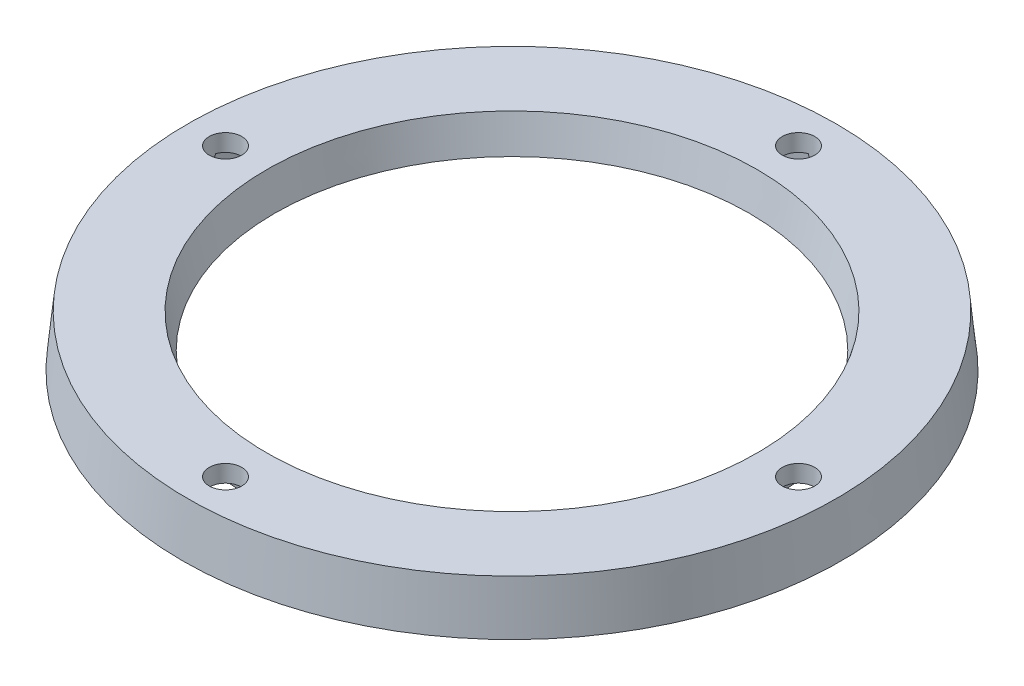
ISO-10303-21;
HEADER;
FILE_DESCRIPTION(('STEP AP214'),'2;1');
FILE_NAME('part.step','',(''),(''),'','','');
FILE_SCHEMA(('AUTOMOTIVE_DESIGN { 1 0 10303 214 1 1 1 1 }'));
ENDSEC;
DATA;
#1=APPLICATION_CONTEXT('core data for automotive mechanical design processes');
#2=APPLICATION_PROTOCOL_DEFINITION('international standard','automotive_design',2000,#1);
#3=PRODUCT_CONTEXT('',#1,'mechanical');
#4=PRODUCT('Part','Part','',(#3));
#5=PRODUCT_RELATED_PRODUCT_CATEGORY('part','',(#4));
#6=PRODUCT_DEFINITION_FORMATION('','',#4);
#7=PRODUCT_DEFINITION_CONTEXT('part definition',#1,'design');
#8=PRODUCT_DEFINITION('design','',#6,#7);
#9=PRODUCT_DEFINITION_SHAPE('','',#8);
#10=(LENGTH_UNIT() NAMED_UNIT(*) SI_UNIT(.MILLI.,.METRE.));
#11=(NAMED_UNIT(*) PLANE_ANGLE_UNIT() SI_UNIT($,.RADIAN.));
#12=(NAMED_UNIT(*) SI_UNIT($,.STERADIAN.) SOLID_ANGLE_UNIT());
#13=UNCERTAINTY_MEASURE_WITH_UNIT(LENGTH_MEASURE(1.E-05),#10,'distance_accuracy_value','');
#14=(GEOMETRIC_REPRESENTATION_CONTEXT(3) GLOBAL_UNCERTAINTY_ASSIGNED_CONTEXT((#13)) GLOBAL_UNIT_ASSIGNED_CONTEXT((#10,
#11,#12)) REPRESENTATION_CONTEXT('',''));
#15=CARTESIAN_POINT('',(0.,0.,0.));
#16=DIRECTION('',(0.,0.,1.));
#17=DIRECTION('',(1.,0.,0.));
#18=AXIS2_PLACEMENT_3D('',#15,#16,#17);
#19=CARTESIAN_POINT('',(0.,0.,25.085));
#20=DIRECTION('',(0.,1.,0.));
#21=DIRECTION('',(0.,0.,1.));
#22=AXIS2_PLACEMENT_3D('',#19,#20,#21);
#23=PLANE('',#22);
#24=CARTESIAN_POINT('',(0.,0.,0.));
#25=DIRECTION('',(0.,-1.,0.));
#26=DIRECTION('',(0.,0.,-1.));
#27=AXIS2_PLACEMENT_3D('',#24,#25,#26);
#28=CIRCLE('',#27,25.085);
#29=CARTESIAN_POINT('',(0.,0.,-25.085));
#30=VERTEX_POINT('',#29);
#31=EDGE_CURVE('E116',#30,#30,#28,.T.);
#32=ORIENTED_EDGE('',*,*,#31,.F.);
#33=EDGE_LOOP('',(#32));
#34=FACE_BOUND('',#33,.T.);
#35=CARTESIAN_POINT('',(0.,0.,0.));
#36=DIRECTION('',(0.,-1.,0.));
#37=DIRECTION('',(0.,0.,-1.));
#38=AXIS2_PLACEMENT_3D('',#35,#36,#37);
#39=CIRCLE('',#38,27.085);
#40=CARTESIAN_POINT('',(0.,0.,-27.085));
#41=VERTEX_POINT('',#40);
#42=EDGE_CURVE('E95',#41,#41,#39,.T.);
#43=ORIENTED_EDGE('',*,*,#42,.T.);
#44=EDGE_LOOP('',(#43));
#45=FACE_BOUND('',#44,.T.);
#46=ADVANCED_FACE('F39',(#34,#45),#23,.F.);
#47=CARTESIAN_POINT('',(0.,4.22,0.));
#48=DIRECTION('',(0.,-1.,0.));
#49=DIRECTION('',(0.,0.,-1.));
#50=AXIS2_PLACEMENT_3D('',#47,#48,#49);
#51=CONICAL_SURFACE('',#50,26.665,0.0991993892689203);
#52=ORIENTED_EDGE('',*,*,#42,.F.);
#53=EDGE_LOOP('',(#52));
#54=FACE_BOUND('',#53,.T.);
#55=CARTESIAN_POINT('',(0.,4.22,0.));
#56=DIRECTION('',(0.,-1.,0.));
#57=DIRECTION('',(0.,0.,-1.));
#58=AXIS2_PLACEMENT_3D('',#55,#56,#57);
#59=CIRCLE('',#58,26.665);
#60=CARTESIAN_POINT('',(0.,4.22,-26.665));
#61=VERTEX_POINT('',#60);
#62=EDGE_CURVE('E138',#61,#61,#59,.T.);
#63=ORIENTED_EDGE('',*,*,#62,.T.);
#64=EDGE_LOOP('',(#63));
#65=FACE_BOUND('',#64,.T.);
#66=ADVANCED_FACE('F202',(#54,#65),#51,.T.);
#67=CARTESIAN_POINT('',(0.,4.22,26.665));
#68=DIRECTION('',(0.,-1.,0.));
#69=DIRECTION('',(0.,0.,-1.));
#70=AXIS2_PLACEMENT_3D('',#67,#68,#69);
#71=PLANE('',#70);
#72=CARTESIAN_POINT('',(-23.546655813512,4.22,0.));
#73=DIRECTION('',(0.,-1.,0.));
#74=DIRECTION('',(0.,0.,-1.));
#75=AXIS2_PLACEMENT_3D('',#72,#73,#74);
#76=CIRCLE('',#75,1.335);
#77=CARTESIAN_POINT('',(-23.546655813512,4.22,-1.335));
#78=VERTEX_POINT('',#77);
#79=EDGE_CURVE('E191',#78,#78,#76,.T.);
#80=ORIENTED_EDGE('',*,*,#79,.T.);
#81=EDGE_LOOP('',(#80));
#82=FACE_BOUND('',#81,.T.);
#83=CARTESIAN_POINT('',(0.,4.22,-23.546655813512));
#84=DIRECTION('',(0.,-1.,0.));
#85=DIRECTION('',(0.,0.,-1.));
#86=AXIS2_PLACEMENT_3D('',#83,#84,#85);
#87=CIRCLE('',#86,1.335);
#88=CARTESIAN_POINT('',(0.,4.22,-24.881655813512));
#89=VERTEX_POINT('',#88);
#90=EDGE_CURVE('E179',#89,#89,#87,.T.);
#91=ORIENTED_EDGE('',*,*,#90,.T.);
#92=EDGE_LOOP('',(#91));
#93=FACE_BOUND('',#92,.T.);
#94=CARTESIAN_POINT('',(23.546655813512,4.22,0.));
#95=DIRECTION('',(0.,-1.,0.));
#96=DIRECTION('',(0.,0.,-1.));
#97=AXIS2_PLACEMENT_3D('',#94,#95,#96);
#98=CIRCLE('',#97,1.335);
#99=CARTESIAN_POINT('',(23.546655813512,4.22,-1.335));
#100=VERTEX_POINT('',#99);
#101=EDGE_CURVE('E180',#100,#100,#98,.T.);
#102=ORIENTED_EDGE('',*,*,#101,.T.);
#103=EDGE_LOOP('',(#102));
#104=FACE_BOUND('',#103,.T.);
#105=CARTESIAN_POINT('',(0.,4.22,23.546655813512));
#106=DIRECTION('',(0.,-1.,0.));
#107=DIRECTION('',(0.,0.,-1.));
#108=AXIS2_PLACEMENT_3D('',#105,#106,#107);
#109=CIRCLE('',#108,1.335);
#110=CARTESIAN_POINT('',(0.,4.22,22.211655813512));
#111=VERTEX_POINT('',#110);
#112=EDGE_CURVE('E104',#111,#111,#109,.T.);
#113=ORIENTED_EDGE('',*,*,#112,.T.);
#114=EDGE_LOOP('',(#113));
#115=FACE_BOUND('',#114,.T.);
#116=ORIENTED_EDGE('',*,*,#62,.F.);
#117=EDGE_LOOP('',(#116));
#118=FACE_BOUND('',#117,.T.);
#119=CARTESIAN_POINT('',(0.,4.22,0.));
#120=DIRECTION('',(0.,-1.,0.));
#121=DIRECTION('',(0.,0.,-1.));
#122=AXIS2_PLACEMENT_3D('',#119,#120,#121);
#123=CIRCLE('',#122,20.165);
#124=CARTESIAN_POINT('',(0.,4.22,-20.165));
#125=VERTEX_POINT('',#124);
#126=EDGE_CURVE('E134',#125,#125,#123,.T.);
#127=ORIENTED_EDGE('',*,*,#126,.T.);
#128=EDGE_LOOP('',(#127));
#129=FACE_BOUND('',#128,.T.);
#130=ADVANCED_FACE('F207',(#82,#93,#104,#115,#118,#129),#71,.F.);
#131=CARTESIAN_POINT('',(0.,1.43,0.));
#132=DIRECTION('',(0.,1.,0.));
#133=DIRECTION('',(0.,0.,1.));
#134=AXIS2_PLACEMENT_3D('',#131,#132,#133);
#135=CONICAL_SURFACE('',#134,19.515,0.228891989947314);
#136=ORIENTED_EDGE('',*,*,#126,.F.);
#137=EDGE_LOOP('',(#136));
#138=FACE_BOUND('',#137,.T.);
#139=CARTESIAN_POINT('',(0.,1.43,0.));
#140=DIRECTION('',(0.,-1.,0.));
#141=DIRECTION('',(0.,0.,-1.));
#142=AXIS2_PLACEMENT_3D('',#139,#140,#141);
#143=CIRCLE('',#142,19.515);
#144=CARTESIAN_POINT('',(0.,1.43,-19.515));
#145=VERTEX_POINT('',#144);
#146=EDGE_CURVE('E130',#145,#145,#143,.T.);
#147=ORIENTED_EDGE('',*,*,#146,.T.);
#148=EDGE_LOOP('',(#147));
#149=FACE_BOUND('',#148,.T.);
#150=ADVANCED_FACE('F212',(#138,#149),#135,.F.);
#151=CARTESIAN_POINT('',(0.,1.43,19.515));
#152=DIRECTION('',(0.,1.,0.));
#153=DIRECTION('',(0.,0.,1.));
#154=AXIS2_PLACEMENT_3D('',#151,#152,#153);
#155=PLANE('',#154);
#156=ORIENTED_EDGE('',*,*,#146,.F.);
#157=EDGE_LOOP('',(#156));
#158=FACE_BOUND('',#157,.T.);
#159=CARTESIAN_POINT('',(0.,1.43,0.));
#160=DIRECTION('',(0.,-1.,0.));
#161=DIRECTION('',(0.,0.,-1.));
#162=AXIS2_PLACEMENT_3D('',#159,#160,#161);
#163=CIRCLE('',#162,21.195);
#164=CARTESIAN_POINT('',(0.,1.43,-21.195));
#165=VERTEX_POINT('',#164);
#166=EDGE_CURVE('E126',#165,#165,#163,.T.);
#167=ORIENTED_EDGE('',*,*,#166,.T.);
#168=EDGE_LOOP('',(#167));
#169=FACE_BOUND('',#168,.T.);
#170=ADVANCED_FACE('F218',(#158,#169),#155,.F.);
#171=CARTESIAN_POINT('',(0.,2.81,0.));
#172=DIRECTION('',(0.,1.,0.));
#173=DIRECTION('',(0.,0.,1.));
#174=AXIS2_PLACEMENT_3D('',#171,#172,#173);
#175=CONICAL_SURFACE('',#174,21.5165053763441,0.228891989947315);
#176=ORIENTED_EDGE('',*,*,#166,.F.);
#177=EDGE_LOOP('',(#176));
#178=FACE_BOUND('',#177,.T.);
#179=CARTESIAN_POINT('',(0.,2.81,0.));
#180=DIRECTION('',(0.,-1.,0.));
#181=DIRECTION('',(0.,0.,-1.));
#182=AXIS2_PLACEMENT_3D('',#179,#180,#181);
#183=CIRCLE('',#182,21.5165053763441);
#184=CARTESIAN_POINT('',(0.,2.81,-21.5165053763441));
#185=VERTEX_POINT('',#184);
#186=EDGE_CURVE('E121',#185,#185,#183,.T.);
#187=ORIENTED_EDGE('',*,*,#186,.T.);
#188=EDGE_LOOP('',(#187));
#189=FACE_BOUND('',#188,.T.);
#190=ADVANCED_FACE('F224',(#178,#189),#175,.T.);
#191=CARTESIAN_POINT('',(0.,2.81,21.5165053763441));
#192=DIRECTION('',(0.,1.,0.));
#193=DIRECTION('',(0.,0.,1.));
#194=AXIS2_PLACEMENT_3D('',#191,#192,#193);
#195=PLANE('',#194);
#196=ORIENTED_EDGE('',*,*,#186,.F.);
#197=EDGE_LOOP('',(#196));
#198=FACE_BOUND('',#197,.T.);
#199=CARTESIAN_POINT('',(0.,2.81,0.));
#200=DIRECTION('',(0.,-1.,0.));
#201=DIRECTION('',(0.,0.,-1.));
#202=AXIS2_PLACEMENT_3D('',#199,#200,#201);
#203=CIRCLE('',#202,24.8053317535545);
#204=CARTESIAN_POINT('',(-0.456644352418415,2.81,24.8011281868246));
#205=VERTEX_POINT('',#204);
#206=CARTESIAN_POINT('',(-24.8011281868246,2.81,0.456644352418356));
#207=VERTEX_POINT('',#206);
#208=EDGE_CURVE('E100',#205,#207,#203,.T.);
#209=ORIENTED_EDGE('',*,*,#208,.T.);
#210=CARTESIAN_POINT('',(-23.546655813512,2.81,0.));
#211=DIRECTION('',(0.,1.,0.));
#212=DIRECTION('',(0.,0.,1.));
#213=AXIS2_PLACEMENT_3D('',#210,#211,#212);
#214=CIRCLE('',#213,1.335);
#215=CARTESIAN_POINT('',(-24.8011281868246,2.81,-0.456644352418414));
#216=VERTEX_POINT('',#215);
#217=EDGE_CURVE('E66',#207,#216,#214,.T.);
#218=ORIENTED_EDGE('',*,*,#217,.T.);
#219=CARTESIAN_POINT('',(-0.456644352418349,2.81,-24.8011281868246));
#220=VERTEX_POINT('',#219);
#221=EDGE_CURVE('E110',#216,#220,#203,.T.);
#222=ORIENTED_EDGE('',*,*,#221,.T.);
#223=CARTESIAN_POINT('',(0.,2.81,-23.546655813512));
#224=DIRECTION('',(0.,1.,0.));
#225=DIRECTION('',(0.,0.,1.));
#226=AXIS2_PLACEMENT_3D('',#223,#224,#225);
#227=CIRCLE('',#226,1.335);
#228=CARTESIAN_POINT('',(0.456644352418415,2.81,-24.8011281868246));
#229=VERTEX_POINT('',#228);
#230=EDGE_CURVE('E59',#220,#229,#227,.T.);
#231=ORIENTED_EDGE('',*,*,#230,.T.);
#232=CARTESIAN_POINT('',(24.8011281868246,2.81,-0.456644352418347));
#233=VERTEX_POINT('',#232);
#234=EDGE_CURVE('E114',#229,#233,#203,.T.);
#235=ORIENTED_EDGE('',*,*,#234,.T.);
#236=CARTESIAN_POINT('',(23.546655813512,2.81,0.));
#237=DIRECTION('',(0.,1.,0.));
#238=DIRECTION('',(0.,0.,1.));
#239=AXIS2_PLACEMENT_3D('',#236,#237,#238);
#240=CIRCLE('',#239,1.335);
#241=CARTESIAN_POINT('',(24.8011281868246,2.81,0.456644352418414));
#242=VERTEX_POINT('',#241);
#243=EDGE_CURVE('E177',#233,#242,#240,.T.);
#244=ORIENTED_EDGE('',*,*,#243,.T.);
#245=CARTESIAN_POINT('',(0.456644352418348,2.81,24.8011281868246));
#246=VERTEX_POINT('',#245);
#247=EDGE_CURVE('E102',#242,#246,#203,.T.);
#248=ORIENTED_EDGE('',*,*,#247,.T.);
#249=CARTESIAN_POINT('',(0.,2.81,23.546655813512));
#250=DIRECTION('',(0.,1.,0.));
#251=DIRECTION('',(0.,0.,1.));
#252=AXIS2_PLACEMENT_3D('',#249,#250,#251);
#253=CIRCLE('',#252,1.335);
#254=EDGE_CURVE('E88',#246,#205,#253,.T.);
#255=ORIENTED_EDGE('',*,*,#254,.T.);
#256=EDGE_LOOP('',(#209,#218,#222,#231,#235,#244,#248,#255));
#257=FACE_BOUND('',#256,.T.);
#258=ADVANCED_FACE('F99',(#198,#257),#195,.F.);
#259=CARTESIAN_POINT('',(0.,0.,0.));
#260=DIRECTION('',(0.,-1.,0.));
#261=DIRECTION('',(0.,0.,-1.));
#262=AXIS2_PLACEMENT_3D('',#259,#260,#261);
#263=CONICAL_SURFACE('',#262,25.085,0.0991993892689197);
#264=ORIENTED_EDGE('',*,*,#221,.F.);
#265=CARTESIAN_POINT('',(-24.8011072175954,2.81020000000008,-0.456701954006309));
#266=CARTESIAN_POINT('',(-24.8063640892538,2.76006097805554,-0.442211795328551));
#267=CARTESIAN_POINT('',(-24.811604977043,2.71008972835411,-0.42708790749464));
#268=CARTESIAN_POINT('',(-24.8220965376518,2.61008356769663,-0.394690385683538));
#269=CARTESIAN_POINT('',(-24.8273463444478,2.56005732383127,-0.37738992713461));
#270=CARTESIAN_POINT('',(-24.8383836286508,2.45491252334263,-0.337852218514495));
#271=CARTESIAN_POINT('',(-24.8441587768961,2.39991525507899,-0.315270386923622));
#272=CARTESIAN_POINT('',(-24.8526038479423,2.31951758866946,-0.277285599035937));
#273=CARTESIAN_POINT('',(-24.8553747709132,2.29314252106301,-0.263983717677163));
#274=CARTESIAN_POINT('',(-24.8608066732607,2.24144681497118,-0.235469897016068));
#275=CARTESIAN_POINT('',(-24.8634678083418,2.21612468274836,-0.22026079568063));
#276=CARTESIAN_POINT('',(-24.8679178812149,2.17378587962839,-0.191425430640762));
#277=CARTESIAN_POINT('',(-24.8697516458518,2.15634106441682,-0.178440860770825));
#278=CARTESIAN_POINT('',(-24.8732241658947,2.12330977449401,-0.150465948412871));
#279=CARTESIAN_POINT('',(-24.8748646994933,2.10770635144756,-0.135497126525794));
#280=CARTESIAN_POINT('',(-24.8770415631904,2.0870033891626,-0.11117951759538));
#281=CARTESIAN_POINT('',(-24.877710220859,2.08064443177077,-0.102926990568714));
#282=CARTESIAN_POINT('',(-24.8789328396104,2.06901765882317,-0.0856616578352358));
#283=CARTESIAN_POINT('',(-24.8794868406719,2.06374946293712,-0.0766491186797244));
#284=CARTESIAN_POINT('',(-24.8803615933126,2.05543131883973,-0.0593052771525328));
#285=CARTESIAN_POINT('',(-24.8807050643532,2.05216529335702,-0.0510807494617058));
#286=CARTESIAN_POINT('',(-24.8812442780422,2.04703803360802,-0.0341996404599012));
#287=CARTESIAN_POINT('',(-24.8814402334136,2.04517477649718,-0.0255437005547414));
#288=CARTESIAN_POINT('',(-24.8816611050154,2.04307460446085,-0.00796596541360226));
#289=CARTESIAN_POINT('',(-24.8816848207471,2.04284910459294,0.000957261347885834));
#290=CARTESIAN_POINT('',(-24.8815545551048,2.04408774065954,0.0186849469528056));
#291=CARTESIAN_POINT('',(-24.8814004566908,2.0455529894712,0.0274893237063454));
#292=CARTESIAN_POINT('',(-24.8809059501211,2.05025510537856,0.045777812396083));
#293=CARTESIAN_POINT('',(-24.8805446219629,2.05369090179332,0.055208919887379));
#294=CARTESIAN_POINT('',(-24.8796683350213,2.06202358831479,0.0733885048103653));
#295=CARTESIAN_POINT('',(-24.8791530998772,2.06692310673404,0.0821357182636405));
#296=CARTESIAN_POINT('',(-24.8776284451976,2.08142202219915,0.104574575847842));
#297=CARTESIAN_POINT('',(-24.8765196040641,2.09196720909325,0.117638831898522));
#298=CARTESIAN_POINT('',(-24.8741228469874,2.11476231578112,0.142155111658755));
#299=CARTESIAN_POINT('',(-24.8728343336394,2.127017922794,0.153601489181488));
#300=CARTESIAN_POINT('',(-24.869469127862,2.1590284495036,0.180724381874081));
#301=CARTESIAN_POINT('',(-24.8673236665538,2.17943877653918,0.195608610497606));
#302=CARTESIAN_POINT('',(-24.8628984540068,2.22154249584273,0.223441547263485));
#303=CARTESIAN_POINT('',(-24.860618391878,2.24323885900205,0.236385509012625));
#304=CARTESIAN_POINT('',(-24.8536247230328,2.30979751921711,0.273308018370049));
#305=CARTESIAN_POINT('',(-24.8487899964317,2.35582157078729,0.295151818817149));
#306=CARTESIAN_POINT('',(-24.8403611772198,2.43608252306285,0.329794769646836));
#307=CARTESIAN_POINT('',(-24.8368005304897,2.46999455992934,0.343409981166896));
#308=CARTESIAN_POINT('',(-24.8296253490353,2.53834600808576,0.369319312501184));
#309=CARTESIAN_POINT('',(-24.826010779435,2.57278576111806,0.381612530992816));
#310=CARTESIAN_POINT('',(-24.8188586127224,2.64094615072809,0.404805386673019));
#311=CARTESIAN_POINT('',(-24.8153220518595,2.67465647620822,0.415736187930295));
#312=CARTESIAN_POINT('',(-24.8082288394044,2.7422824339577,0.436783179126841));
#313=CARTESIAN_POINT('',(-24.8046722184621,2.7761977568147,0.446900370540342));
#314=CARTESIAN_POINT('',(-24.8011072175954,2.81020000000033,0.456701954006505));
#315=B_SPLINE_CURVE_WITH_KNOTS('',3,(#265,#266,#267,#268,#269,#270,#271,#272,#273,#274,#275,
#276,#277,#278,#279,#280,#281,#282,#283,#284,#285,#286,#287,#288,#289,#290,#291,#292,#293,#294,
#295,#296,#297,#298,#299,#300,#301,#302,#303,#304,#305,#306,#307,#308,#309,#310,#311,#312,#313,
#314),.UNSPECIFIED.,.F.,.F.,(4,2,2,2,2,2,2,2,2,2,2,2,2,2,2,2,2,2,2,2,2,2,2,2,4),(0.,
0.157373641700761,0.31692251680762,0.495890508437174,0.584853236667456,0.673685124070241,
0.739071601815973,0.803799471283287,0.835057670962561,0.866304953007053,0.892770958840108,
0.919198726211603,0.945810518123953,0.972439836329236,1.00240486172737,1.03242402017048,
1.08261580566065,1.13297864371341,1.2088391217718,1.28488224745512,1.43810744344775,
1.54824429500986,1.65845576704317,1.76528937320915,1.87198939808788),.UNSPECIFIED.);
#316=EDGE_CURVE('E11',#216,#207,#315,.T.);
#317=ORIENTED_EDGE('',*,*,#316,.T.);
#318=ORIENTED_EDGE('',*,*,#208,.F.);
#319=CARTESIAN_POINT('',(-0.456701954006311,2.81020000000008,24.8011072175954));
#320=CARTESIAN_POINT('',(-0.442211795328555,2.76006097805555,24.8063640892538));
#321=CARTESIAN_POINT('',(-0.427087907494645,2.71008972835411,24.811604977043));
#322=CARTESIAN_POINT('',(-0.394690385683543,2.61008356769664,24.8220965376518));
#323=CARTESIAN_POINT('',(-0.377389927134613,2.56005732383128,24.8273463444478));
#324=CARTESIAN_POINT('',(-0.337852218514499,2.45491252334263,24.8383836286508));
#325=CARTESIAN_POINT('',(-0.315270386923627,2.39991525507899,24.8441587768961));
#326=CARTESIAN_POINT('',(-0.27728559903594,2.31951758866946,24.8526038479423));
#327=CARTESIAN_POINT('',(-0.263983717677163,2.29314252106301,24.8553747709132));
#328=CARTESIAN_POINT('',(-0.235469897016072,2.24144681497117,24.8608066732607));
#329=CARTESIAN_POINT('',(-0.22026079568064,2.21612468274835,24.8634678083418));
#330=CARTESIAN_POINT('',(-0.191425430640761,2.17378587962839,24.8679178812149));
#331=CARTESIAN_POINT('',(-0.178440860770813,2.15634106441683,24.8697516458518));
#332=CARTESIAN_POINT('',(-0.150465948412853,2.12330977449402,24.8732241658947));
#333=CARTESIAN_POINT('',(-0.135497126525781,2.10770635144757,24.8748646994933));
#334=CARTESIAN_POINT('',(-0.11117951759539,2.08700338916258,24.8770415631904));
#335=CARTESIAN_POINT('',(-0.102926990568733,2.08064443177074,24.877710220859));
#336=CARTESIAN_POINT('',(-0.0856616578352548,2.06901765882314,24.8789328396104));
#337=CARTESIAN_POINT('',(-0.0766491186797342,2.0637494629371,24.8794868406719));
#338=CARTESIAN_POINT('',(-0.0593052771525269,2.05543131883974,24.8803615933126));
#339=CARTESIAN_POINT('',(-0.051080749461693,2.05216529335705,24.8807050643532));
#340=CARTESIAN_POINT('',(-0.0341996404598847,2.04703803360804,24.8812442780422));
#341=CARTESIAN_POINT('',(-0.0255437005547282,2.04517477649717,24.8814402334136));
#342=CARTESIAN_POINT('',(-0.00796596541358971,2.04307460446085,24.8816611050154));
#343=CARTESIAN_POINT('',(0.000957261347901012,2.04284910459296,24.8816848207471));
#344=CARTESIAN_POINT('',(0.0186849469528276,2.04408774065957,24.8815545551048));
#345=CARTESIAN_POINT('',(0.0274893237063715,2.04555298947121,24.8814004566908));
#346=CARTESIAN_POINT('',(0.0457778123961138,2.05025510537856,24.8809059501211));
#347=CARTESIAN_POINT('',(0.0552089198874097,2.05369090179332,24.8805446219629));
#348=CARTESIAN_POINT('',(0.073388504810397,2.06202358831481,24.8796683350213));
#349=CARTESIAN_POINT('',(0.0821357182636733,2.06692310673405,24.8791530998772));
#350=CARTESIAN_POINT('',(0.104574575847881,2.08142202219917,24.8776284451976));
#351=CARTESIAN_POINT('',(0.117638831898568,2.09196720909328,24.8765196040641));
#352=CARTESIAN_POINT('',(0.1421551116588,2.11476231578117,24.8741228469874));
#353=CARTESIAN_POINT('',(0.153601489181525,2.12701792279406,24.8728343336394));
#354=CARTESIAN_POINT('',(0.180724381874122,2.15902844950369,24.869469127862));
#355=CARTESIAN_POINT('',(0.195608610497667,2.17943877653928,24.8673236665538));
#356=CARTESIAN_POINT('',(0.223441547263568,2.22154249584285,24.8628984540068));
#357=CARTESIAN_POINT('',(0.236385509012708,2.24323885900219,24.860618391878));
#358=CARTESIAN_POINT('',(0.273308018370136,2.3097975192173,24.8536247230328));
#359=CARTESIAN_POINT('',(0.295151818817237,2.3558215707875,24.8487899964317));
#360=CARTESIAN_POINT('',(0.329794769646926,2.43608252306306,24.8403611772198));
#361=CARTESIAN_POINT('',(0.343409981166984,2.46999455992953,24.8368005304897));
#362=CARTESIAN_POINT('',(0.36931931250125,2.5383460080859,24.8296253490352));
#363=CARTESIAN_POINT('',(0.381612530992862,2.57278576111818,24.826010779435));
#364=CARTESIAN_POINT('',(0.404805386673047,2.64094615072817,24.8188586127224));
#365=CARTESIAN_POINT('',(0.415736187930323,2.67465647620829,24.8153220518595));
#366=CARTESIAN_POINT('',(0.436783179126867,2.74228243395773,24.8082288394044));
#367=CARTESIAN_POINT('',(0.446900370540363,2.77619775681471,24.8046722184621));
#368=CARTESIAN_POINT('',(0.456701954006507,2.81020000000033,24.8011072175954));
#369=B_SPLINE_CURVE_WITH_KNOTS('',3,(#319,#320,#321,#322,#323,#324,#325,#326,#327,#328,#329,
#330,#331,#332,#333,#334,#335,#336,#337,#338,#339,#340,#341,#342,#343,#344,#345,#346,#347,#348,
#349,#350,#351,#352,#353,#354,#355,#356,#357,#358,#359,#360,#361,#362,#363,#364,#365,#366,#367,
#368),.UNSPECIFIED.,.F.,.F.,(4,2,2,2,2,2,2,2,2,2,2,2,2,2,2,2,2,2,2,2,2,2,2,2,4),(0.,
0.157373641700752,0.316922516807612,0.495890508437174,0.584853236667457,0.673685124070241,
0.739071601815973,0.803799471283287,0.835057670962564,0.866304953007058,0.892770958840118,
0.919198726211619,0.945810518123973,0.972439836329261,1.0024048617274,1.03242402017052,
1.08261580566071,1.13297864371349,1.20883912177193,1.2848822474553,1.43810744344801,
1.54824429501004,1.65845576704328,1.7652893732092,1.87198939808787),.UNSPECIFIED.);
#370=EDGE_CURVE('E84',#205,#246,#369,.T.);
#371=ORIENTED_EDGE('',*,*,#370,.T.);
#372=ORIENTED_EDGE('',*,*,#247,.F.);
#373=CARTESIAN_POINT('',(24.8011072175954,2.81020000000038,0.45670195400639));
#374=CARTESIAN_POINT('',(24.8063640892538,2.76006097805585,0.442211795328641));
#375=CARTESIAN_POINT('',(24.811604977043,2.71008972835441,0.427087907494738));
#376=CARTESIAN_POINT('',(24.8220965376518,2.61008356769693,0.394690385683649));
#377=CARTESIAN_POINT('',(24.8273463444478,2.56005732383157,0.377389927134726));
#378=CARTESIAN_POINT('',(24.8383836286508,2.45491252334293,0.33785221851462));
#379=CARTESIAN_POINT('',(24.844158776896,2.3999152550793,0.315270386923749));
#380=CARTESIAN_POINT('',(24.8526038479422,2.31951758866976,0.277285599036078));
#381=CARTESIAN_POINT('',(24.8553747709131,2.29314252106331,0.263983717677309));
#382=CARTESIAN_POINT('',(24.8608066732606,2.24144681497147,0.235469897016227));
#383=CARTESIAN_POINT('',(24.8634678083417,2.21612468274864,0.220260795680796));
#384=CARTESIAN_POINT('',(24.8679178812149,2.17378587962862,0.191425430640926));
#385=CARTESIAN_POINT('',(24.8697516458518,2.15634106441701,0.178440860770975));
#386=CARTESIAN_POINT('',(24.8732241658946,2.12330977449413,0.150465948412979));
#387=CARTESIAN_POINT('',(24.8748646994933,2.10770635144766,0.135497126525874));
#388=CARTESIAN_POINT('',(24.8770415631904,2.08700338916265,0.111179517595456));
#389=CARTESIAN_POINT('',(24.877710220859,2.08064443177081,0.102926990568803));
#390=CARTESIAN_POINT('',(24.8789328396104,2.0690176588232,0.0856616578353333));
#391=CARTESIAN_POINT('',(24.8794868406719,2.06374946293715,0.0766491186798167));
#392=CARTESIAN_POINT('',(24.8803615933126,2.05543131883978,0.0593052771526128));
#393=CARTESIAN_POINT('',(24.8807050643532,2.05216529335709,0.0510807494617783));
#394=CARTESIAN_POINT('',(24.8812442780422,2.04703803360807,0.0341996404599697));
#395=CARTESIAN_POINT('',(24.8814402334136,2.0451747764972,0.0255437005548135));
#396=CARTESIAN_POINT('',(24.8816611050154,2.04307460446086,0.00796596541367166));
#397=CARTESIAN_POINT('',(24.8816848207471,2.04284910459296,-0.000957261347822819));
#398=CARTESIAN_POINT('',(24.8815545551048,2.04408774065958,-0.0186849469527548));
#399=CARTESIAN_POINT('',(24.8814004566908,2.04555298947123,-0.0274893237063004));
#400=CARTESIAN_POINT('',(24.8809059501212,2.05025510537858,-0.0457778123960391));
#401=CARTESIAN_POINT('',(24.8805446219629,2.05369090179333,-0.0552089198873308));
#402=CARTESIAN_POINT('',(24.8796683350213,2.0620235883148,-0.0733885048103075));
#403=CARTESIAN_POINT('',(24.8791530998772,2.06692310673404,-0.0821357182635775));
#404=CARTESIAN_POINT('',(24.8776284451976,2.08142202219912,-0.104574575847774));
#405=CARTESIAN_POINT('',(24.8765196040641,2.0919672090932,-0.117638831898463));
#406=CARTESIAN_POINT('',(24.8741228469874,2.11476231578104,-0.142155111658686));
#407=CARTESIAN_POINT('',(24.8728343336394,2.12701792279392,-0.153601489181403));
#408=CARTESIAN_POINT('',(24.869469127862,2.1590284495035,-0.180724381873966));
#409=CARTESIAN_POINT('',(24.8673236665538,2.17943877653905,-0.195608610497487));
#410=CARTESIAN_POINT('',(24.8628984540068,2.22154249584253,-0.223441547263353));
#411=CARTESIAN_POINT('',(24.8606183918781,2.24323885900183,-0.236385509012483));
#412=CARTESIAN_POINT('',(24.8536247230328,2.3097975192168,-0.273308018369881));
#413=CARTESIAN_POINT('',(24.8487899964318,2.35582157078692,-0.295151818816964));
#414=CARTESIAN_POINT('',(24.8403611772199,2.43608252306242,-0.329794769646662));
#415=CARTESIAN_POINT('',(24.8368005304897,2.46999455992892,-0.343409981166742));
#416=CARTESIAN_POINT('',(24.8296253490353,2.53834600808536,-0.369319312501049));
#417=CARTESIAN_POINT('',(24.8260107794351,2.57278576111768,-0.381612530992679));
#418=CARTESIAN_POINT('',(24.8188586127225,2.64094615072773,-0.404805386672896));
#419=CARTESIAN_POINT('',(24.8153220518596,2.67465647620788,-0.415736187930185));
#420=CARTESIAN_POINT('',(24.8082288394044,2.74228243395737,-0.436783179126752));
#421=CARTESIAN_POINT('',(24.8046722184621,2.77619775681438,-0.446900370540259));
#422=CARTESIAN_POINT('',(24.8011072175954,2.81020000000003,-0.456701954006412));
#423=B_SPLINE_CURVE_WITH_KNOTS('',3,(#373,#374,#375,#376,#377,#378,#379,#380,#381,#382,#383,
#384,#385,#386,#387,#388,#389,#390,#391,#392,#393,#394,#395,#396,#397,#398,#399,#400,#401,#402,
#403,#404,#405,#406,#407,#408,#409,#410,#411,#412,#413,#414,#415,#416,#417,#418,#419,#420,#421,
#422),.UNSPECIFIED.,.F.,.F.,(4,2,2,2,2,2,2,2,2,2,2,2,2,2,2,2,2,2,2,2,2,2,2,2,4),(0.,
0.157373641700763,0.316922516807606,0.495890508437156,0.584853236667439,0.67368512407023,
0.739071601816082,0.803799471283511,0.835057670962782,0.866304953007273,0.89277095884034,
0.919198726211844,0.945810518124207,0.972439836329506,1.00240486172762,1.03242402017071,
1.08261580566085,1.13297864371358,1.20883912177188,1.28488224745511,1.43810744344756,
1.54824429500971,1.65845576704307,1.76528937320908,1.87198939808785),.UNSPECIFIED.);
#424=EDGE_CURVE('E94',#242,#233,#423,.T.);
#425=ORIENTED_EDGE('',*,*,#424,.T.);
#426=ORIENTED_EDGE('',*,*,#234,.F.);
#427=CARTESIAN_POINT('',(0.456701954006392,2.81020000000038,-24.8011072175954));
#428=CARTESIAN_POINT('',(0.442211795328642,2.76006097805585,-24.8063640892538));
#429=CARTESIAN_POINT('',(0.427087907494739,2.71008972835441,-24.811604977043));
#430=CARTESIAN_POINT('',(0.394690385683651,2.61008356769693,-24.8220965376518));
#431=CARTESIAN_POINT('',(0.377389927134729,2.56005732383157,-24.8273463444478));
#432=CARTESIAN_POINT('',(0.337852218514623,2.45491252334293,-24.8383836286508));
#433=CARTESIAN_POINT('',(0.315270386923751,2.3999152550793,-24.844158776896));
#434=CARTESIAN_POINT('',(0.277285599036081,2.31951758866976,-24.8526038479422));
#435=CARTESIAN_POINT('',(0.263983717677313,2.2931425210633,-24.8553747709131));
#436=CARTESIAN_POINT('',(0.235469897016231,2.24144681497147,-24.8608066732606));
#437=CARTESIAN_POINT('',(0.2202607956808,2.21612468274864,-24.8634678083417));
#438=CARTESIAN_POINT('',(0.191425430640929,2.17378587962862,-24.8679178812149));
#439=CARTESIAN_POINT('',(0.178440860770978,2.15634106441701,-24.8697516458518));
#440=CARTESIAN_POINT('',(0.150465948412982,2.12330977449413,-24.8732241658946));
#441=CARTESIAN_POINT('',(0.135497126525878,2.10770635144766,-24.8748646994933));
#442=CARTESIAN_POINT('',(0.111179517595461,2.08700338916265,-24.8770415631904));
#443=CARTESIAN_POINT('',(0.102926990568807,2.0806444317708,-24.877710220859));
#444=CARTESIAN_POINT('',(0.0856616578353377,2.06901765882319,-24.8789328396104));
#445=CARTESIAN_POINT('',(0.0766491186798208,2.06374946293715,-24.8794868406719));
#446=CARTESIAN_POINT('',(0.0593052771526168,2.05543131883978,-24.8803615933126));
#447=CARTESIAN_POINT('',(0.0510807494617824,2.05216529335708,-24.8807050643532));
#448=CARTESIAN_POINT('',(0.0341996404599737,2.04703803360806,-24.8812442780422));
#449=CARTESIAN_POINT('',(0.0255437005548174,2.04517477649719,-24.8814402334136));
#450=CARTESIAN_POINT('',(0.00796596541367461,2.04307460446085,-24.8816611050154));
#451=CARTESIAN_POINT('',(-0.000957261347820563,2.04284910459296,-24.8816848207471));
#452=CARTESIAN_POINT('',(-0.0186849469527516,2.04408774065957,-24.8815545551048));
#453=CARTESIAN_POINT('',(-0.0274893237062955,2.04555298947123,-24.8814004566908));
#454=CARTESIAN_POINT('',(-0.0457778123960408,2.05025510537857,-24.8809059501212));
#455=CARTESIAN_POINT('',(-0.055208919887342,2.0536909017933,-24.8805446219629));
#456=CARTESIAN_POINT('',(-0.0733885048103188,2.06202358831476,-24.8796683350213));
#457=CARTESIAN_POINT('',(-0.0821357182635793,2.06692310673402,-24.8791530998772));
#458=CARTESIAN_POINT('',(-0.104574575847763,2.08142202219913,-24.8776284451976));
#459=CARTESIAN_POINT('',(-0.117638831898457,2.0919672090932,-24.8765196040641));
#460=CARTESIAN_POINT('',(-0.142155111658685,2.11476231578103,-24.8741228469874));
#461=CARTESIAN_POINT('',(-0.153601489181399,2.12701792279391,-24.8728343336394));
#462=CARTESIAN_POINT('',(-0.18072438187396,2.15902844950349,-24.869469127862));
#463=CARTESIAN_POINT('',(-0.195608610497482,2.17943877653903,-24.8673236665538));
#464=CARTESIAN_POINT('',(-0.223441547263348,2.22154249584251,-24.8628984540068));
#465=CARTESIAN_POINT('',(-0.236385509012476,2.24323885900181,-24.8606183918781));
#466=CARTESIAN_POINT('',(-0.273308018369873,2.30979751921678,-24.8536247230328));
#467=CARTESIAN_POINT('',(-0.295151818816957,2.35582157078689,-24.8487899964318));
#468=CARTESIAN_POINT('',(-0.329794769646654,2.4360825230624,-24.8403611772199));
#469=CARTESIAN_POINT('',(-0.343409981166733,2.4699945599289,-24.8368005304897));
#470=CARTESIAN_POINT('',(-0.369319312501048,2.53834600808534,-24.8296253490353));
#471=CARTESIAN_POINT('',(-0.381612530992687,2.57278576111766,-24.8260107794351));
#472=CARTESIAN_POINT('',(-0.404805386672906,2.64094615072772,-24.8188586127225));
#473=CARTESIAN_POINT('',(-0.415736187930189,2.67465647620786,-24.8153220518596));
#474=CARTESIAN_POINT('',(-0.436783179126748,2.74228243395737,-24.8082288394044));
#475=CARTESIAN_POINT('',(-0.446900370540253,2.77619775681438,-24.8046722184621));
#476=CARTESIAN_POINT('',(-0.456701954006414,2.81020000000003,-24.8011072175954));
#477=B_SPLINE_CURVE_WITH_KNOTS('',3,(#427,#428,#429,#430,#431,#432,#433,#434,#435,#436,#437,
#438,#439,#440,#441,#442,#443,#444,#445,#446,#447,#448,#449,#450,#451,#452,#453,#454,#455,#456,
#457,#458,#459,#460,#461,#462,#463,#464,#465,#466,#467,#468,#469,#470,#471,#472,#473,#474,#475,
#476),.UNSPECIFIED.,.F.,.F.,(4,2,2,2,2,2,2,2,2,2,2,2,2,2,2,2,2,2,2,2,2,2,2,2,4),(0.,
0.157373641700762,0.316922516807606,0.495890508437156,0.584853236667439,0.67368512407023,
0.739071601816083,0.803799471283512,0.835057670962784,0.866304953007275,0.892770958840343,
0.919198726211847,0.945810518124211,0.972439836329511,1.00240486172763,1.03242402017072,
1.08261580566086,1.13297864371358,1.20883912177188,1.28488224745511,1.43810744344755,
1.54824429500971,1.65845576704308,1.7652893732091,1.87198939808787),.UNSPECIFIED.);
#478=EDGE_CURVE('E53',#229,#220,#477,.T.);
#479=ORIENTED_EDGE('',*,*,#478,.T.);
#480=EDGE_LOOP('',(#264,#317,#318,#371,#372,#425,#426,#479));
#481=FACE_BOUND('',#480,.T.);
#482=ORIENTED_EDGE('',*,*,#31,.T.);
#483=EDGE_LOOP('',(#482));
#484=FACE_BOUND('',#483,.T.);
#485=ADVANCED_FACE('F107',(#481,#484),#263,.F.);
#486=CARTESIAN_POINT('',(0.,0.,23.546655813512));
#487=DIRECTION('',(0.,1.,0.));
#488=DIRECTION('',(0.,0.,1.));
#489=AXIS2_PLACEMENT_3D('',#486,#487,#488);
#490=CYLINDRICAL_SURFACE('',#489,1.335);
#491=ORIENTED_EDGE('',*,*,#370,.F.);
#492=ORIENTED_EDGE('',*,*,#254,.F.);
#493=EDGE_LOOP('',(#491,#492));
#494=FACE_BOUND('',#493,.T.);
#495=ORIENTED_EDGE('',*,*,#112,.F.);
#496=EDGE_LOOP('',(#495));
#497=FACE_BOUND('',#496,.T.);
#498=ADVANCED_FACE('F86',(#494,#497),#490,.F.);
#499=CARTESIAN_POINT('',(23.546655813512,0.,0.));
#500=DIRECTION('',(0.,1.,0.));
#501=DIRECTION('',(0.,0.,1.));
#502=AXIS2_PLACEMENT_3D('',#499,#500,#501);
#503=CYLINDRICAL_SURFACE('',#502,1.335);
#504=ORIENTED_EDGE('',*,*,#424,.F.);
#505=ORIENTED_EDGE('',*,*,#243,.F.);
#506=EDGE_LOOP('',(#504,#505));
#507=FACE_BOUND('',#506,.T.);
#508=ORIENTED_EDGE('',*,*,#101,.F.);
#509=EDGE_LOOP('',(#508));
#510=FACE_BOUND('',#509,.T.);
#511=ADVANCED_FACE('F159',(#507,#510),#503,.F.);
#512=CARTESIAN_POINT('',(0.,0.,-23.546655813512));
#513=DIRECTION('',(0.,1.,0.));
#514=DIRECTION('',(0.,0.,1.));
#515=AXIS2_PLACEMENT_3D('',#512,#513,#514);
#516=CYLINDRICAL_SURFACE('',#515,1.335);
#517=ORIENTED_EDGE('',*,*,#478,.F.);
#518=ORIENTED_EDGE('',*,*,#230,.F.);
#519=EDGE_LOOP('',(#517,#518));
#520=FACE_BOUND('',#519,.T.);
#521=ORIENTED_EDGE('',*,*,#90,.F.);
#522=EDGE_LOOP('',(#521));
#523=FACE_BOUND('',#522,.T.);
#524=ADVANCED_FACE('F163',(#520,#523),#516,.F.);
#525=CARTESIAN_POINT('',(-23.546655813512,0.,0.));
#526=DIRECTION('',(0.,1.,0.));
#527=DIRECTION('',(0.,0.,1.));
#528=AXIS2_PLACEMENT_3D('',#525,#526,#527);
#529=CYLINDRICAL_SURFACE('',#528,1.335);
#530=ORIENTED_EDGE('',*,*,#316,.F.);
#531=ORIENTED_EDGE('',*,*,#217,.F.);
#532=EDGE_LOOP('',(#530,#531));
#533=FACE_BOUND('',#532,.T.);
#534=ORIENTED_EDGE('',*,*,#79,.F.);
#535=EDGE_LOOP('',(#534));
#536=FACE_BOUND('',#535,.T.);
#537=ADVANCED_FACE('F167',(#533,#536),#529,.F.);
#538=CLOSED_SHELL('',(#46,#66,#130,#150,#170,#190,#258,#485,#498,#511,#524,#537));
#539=MANIFOLD_SOLID_BREP('B2',#538);
#540=ADVANCED_BREP_SHAPE_REPRESENTATION('',(#18,#539),#14);
#541=SHAPE_DEFINITION_REPRESENTATION(#9,#540);
ENDSEC;
END-ISO-10303-21;
